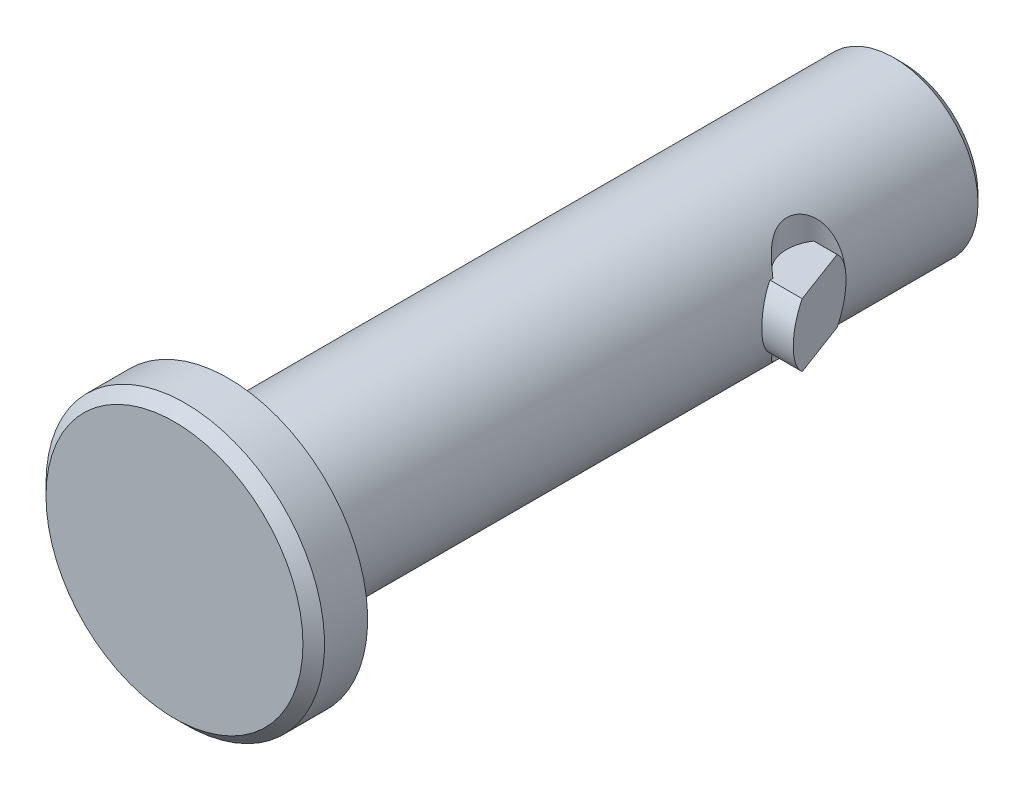
ISO-10303-21;
HEADER;
FILE_DESCRIPTION(('STEP AP214'),'2;1');
FILE_NAME('part.step','',(''),(''),'','','');
FILE_SCHEMA(('AUTOMOTIVE_DESIGN { 1 0 10303 214 1 1 1 1 }'));
ENDSEC;
DATA;
#1=APPLICATION_CONTEXT('core data for automotive mechanical design processes');
#2=APPLICATION_PROTOCOL_DEFINITION('international standard','automotive_design',2000,#1);
#3=PRODUCT_CONTEXT('',#1,'mechanical');
#4=PRODUCT('Part','Part','',(#3));
#5=PRODUCT_RELATED_PRODUCT_CATEGORY('part','',(#4));
#6=PRODUCT_DEFINITION_FORMATION('','',#4);
#7=PRODUCT_DEFINITION_CONTEXT('part definition',#1,'design');
#8=PRODUCT_DEFINITION('design','',#6,#7);
#9=PRODUCT_DEFINITION_SHAPE('','',#8);
#10=(LENGTH_UNIT() NAMED_UNIT(*) SI_UNIT(.MILLI.,.METRE.));
#11=(NAMED_UNIT(*) PLANE_ANGLE_UNIT() SI_UNIT($,.RADIAN.));
#12=(NAMED_UNIT(*) SI_UNIT($,.STERADIAN.) SOLID_ANGLE_UNIT());
#13=UNCERTAINTY_MEASURE_WITH_UNIT(LENGTH_MEASURE(1.E-05),#10,'distance_accuracy_value','');
#14=(GEOMETRIC_REPRESENTATION_CONTEXT(3) GLOBAL_UNCERTAINTY_ASSIGNED_CONTEXT((#13)) GLOBAL_UNIT_ASSIGNED_CONTEXT((#10,
#11,#12)) REPRESENTATION_CONTEXT('',''));
#15=CARTESIAN_POINT('',(0.,0.,0.));
#16=DIRECTION('',(0.,0.,1.));
#17=DIRECTION('',(1.,0.,0.));
#18=AXIS2_PLACEMENT_3D('',#15,#16,#17);
#19=CARTESIAN_POINT('',(7.52684604540094,0.,-4.365625));
#20=DIRECTION('',(-1.,0.,0.));
#21=DIRECTION('',(0.,0.,1.));
#22=AXIS2_PLACEMENT_3D('',#19,#20,#21);
#23=CYLINDRICAL_SURFACE('',#22,1.190625);
#24=CARTESIAN_POINT('',(2.20747783092457,-0.89296875,-3.57810058631593));
#25=CARTESIAN_POINT('',(2.22525680015437,-0.849118208640584,-3.52835882649439));
#26=CARTESIAN_POINT('',(2.24313407200631,-0.801072305564748,-3.48227722960395));
#27=CARTESIAN_POINT('',(2.27746518783692,-0.697456378424291,-3.39836114968579));
#28=CARTESIAN_POINT('',(2.29391270999232,-0.641855473600286,-3.36056227142309));
#29=CARTESIAN_POINT('',(2.3236242177249,-0.524231588072238,-3.29449107584015));
#30=CARTESIAN_POINT('',(2.33687981597009,-0.462192287799817,-3.26624377998065));
#31=CARTESIAN_POINT('',(2.35866945403295,-0.333561056963378,-3.22065147285962));
#32=CARTESIAN_POINT('',(2.36721380741355,-0.266979432409976,-3.2032826357279));
#33=CARTESIAN_POINT('',(2.37818763127264,-0.136251408955325,-3.18110116166184));
#34=CARTESIAN_POINT('',(2.38101464153077,-0.0722771285386694,-3.17547130256736));
#35=CARTESIAN_POINT('',(2.38145677203617,0.0557760872856067,-3.17458587076914));
#36=CARTESIAN_POINT('',(2.3790714874507,0.119855030435997,-3.17933110388651));
#37=CARTESIAN_POINT('',(2.36965152894771,0.242153254781239,-3.19834368794742));
#38=CARTESIAN_POINT('',(2.36291082570402,0.30049094447119,-3.21200950206002));
#39=CARTESIAN_POINT('',(2.34569259379064,0.41397395303492,-3.24770104765574));
#40=CARTESIAN_POINT('',(2.33521352936566,0.469117949070448,-3.26973021512522));
#41=CARTESIAN_POINT('',(2.31085590834111,0.577520424515127,-3.32261641914498));
#42=CARTESIAN_POINT('',(2.29684066119993,0.630568288033956,-3.35383987848441));
#43=CARTESIAN_POINT('',(2.26692822121497,0.730835342606355,-3.42371318473207));
#44=CARTESIAN_POINT('',(2.25103296201118,0.77806042213967,-3.46235542630252));
#45=CARTESIAN_POINT('',(2.22578494955281,0.846720499114228,-3.52787712032862));
#46=CARTESIAN_POINT('',(2.21661225812541,0.870399574400468,-3.55250655751529));
#47=CARTESIAN_POINT('',(2.20747783092457,0.892968750000055,-3.57810058631587));
#48=B_SPLINE_CURVE_WITH_KNOTS('',3,(#24,#25,#26,#27,#28,#29,#30,#31,#32,#33,#34,#35,#36,#37,#38,
#39,#40,#41,#42,#43,#44,#45,#46,#47),.UNSPECIFIED.,.F.,.F.,(4,2,2,2,2,2,2,2,2,2,2,4),(0.,
0.205828446220349,0.412525042908372,0.619758984461825,0.826537442787844,1.01836168407521,
1.210200824653,1.39028022794186,1.57043369495955,1.75905905099473,1.94749206110609,
2.05348674921113),.UNSPECIFIED.);
#49=CARTESIAN_POINT('',(2.20747783092457,-0.892968750000001,-3.57810058631593));
#50=VERTEX_POINT('',#49);
#51=CARTESIAN_POINT('',(2.20747783092457,0.89296875,-3.57810058631593));
#52=VERTEX_POINT('',#51);
#53=EDGE_CURVE('E105',#50,#52,#48,.T.);
#54=ORIENTED_EDGE('',*,*,#53,.F.);
#55=DIRECTION('',(-1.,0.,0.));
#56=VECTOR('',#55,1.);
#57=CARTESIAN_POINT('',(7.52684604540094,-0.89296875,-3.57810058631593));
#58=LINE('',#57,#56);
#59=CARTESIAN_POINT('',(3.11975911444206,-0.892968750000001,-3.57810058631593));
#60=VERTEX_POINT('',#59);
#61=EDGE_CURVE('E181',#60,#50,#58,.T.);
#62=ORIENTED_EDGE('',*,*,#61,.F.);
#63=CARTESIAN_POINT('',(2.82575,0.,-4.365625));
#64=DIRECTION('',(0.936841514727357,0.,-0.349754165498214));
#65=DIRECTION('',(-0.349754165498214,0.,-0.936841514727357));
#66=AXIS2_PLACEMENT_3D('',#63,#64,#65);
#67=ELLIPSE('',#66,1.27089265503622,1.190625);
#68=CARTESIAN_POINT('',(3.11975911444206,0.892968750000001,-3.57810058631593));
#69=VERTEX_POINT('',#68);
#70=EDGE_CURVE('E172',#69,#60,#67,.T.);
#71=ORIENTED_EDGE('',*,*,#70,.F.);
#72=DIRECTION('',(-1.,0.,0.));
#73=VECTOR('',#72,1.);
#74=CARTESIAN_POINT('',(7.52684604540094,0.89296875,-3.57810058631593));
#75=LINE('',#74,#73);
#76=EDGE_CURVE('E183',#52,#69,#75,.F.);
#77=ORIENTED_EDGE('',*,*,#76,.F.);
#78=EDGE_LOOP('',(#54,#62,#71,#77));
#79=FACE_BOUND('',#78,.T.);
#80=ADVANCED_FACE('F50',(#79),#23,.T.);
#81=CARTESIAN_POINT('',(1.8722949957741,0.892968750000001,-5.15314941368407));
#82=CARTESIAN_POINT('',(1.8924211808117,0.866354432189095,-5.18330849928666));
#83=CARTESIAN_POINT('',(1.91360734113642,0.838613594980945,-5.21170159746814));
#84=CARTESIAN_POINT('',(1.95752494145351,0.781159331663294,-5.26502461717634));
#85=CARTESIAN_POINT('',(1.98025481773852,0.751447902359859,-5.28995796756797));
#86=CARTESIAN_POINT('',(2.02680712786073,0.690174043152793,-5.33656978009507));
#87=CARTESIAN_POINT('',(2.05063303605374,0.658605623896169,-5.35823680547731));
#88=CARTESIAN_POINT('',(2.0987344869542,0.593794221565538,-5.3983147003694));
#89=CARTESIAN_POINT('',(2.12301001502869,0.560551292928417,-5.41672567564303));
#90=CARTESIAN_POINT('',(2.17652362098646,0.484964368610081,-5.45399100235197));
#91=CARTESIAN_POINT('',(2.20570278645101,0.4422038347717,-5.47208455625324));
#92=CARTESIAN_POINT('',(2.26176158181058,0.353519397713882,-5.50353085010909));
#93=CARTESIAN_POINT('',(2.28864520831244,0.30760125456047,-5.51689196262031));
#94=CARTESIAN_POINT('',(2.32485579210587,0.233511588261585,-5.53342633129468));
#95=CARTESIAN_POINT('',(2.3365555238136,0.206942952962199,-5.5384544513578));
#96=CARTESIAN_POINT('',(2.3566727301414,0.152352249234631,-5.54678334342676));
#97=CARTESIAN_POINT('',(2.36510038011547,0.124334998676903,-5.55008948149732));
#98=CARTESIAN_POINT('',(2.37608201779761,0.0718442318534708,-5.55432064122322));
#99=CARTESIAN_POINT('',(2.37938123177246,0.0475590769546224,-5.55555083870367));
#100=CARTESIAN_POINT('',(2.38191355587191,-0.0012485889881016,-5.55649879661826));
#101=CARTESIAN_POINT('',(2.38114991351363,-0.0257708948259117,-5.55621776500416));
#102=CARTESIAN_POINT('',(2.37575315540358,-0.0741787014299199,-5.5541836872776));
#103=CARTESIAN_POINT('',(2.37113796577999,-0.0980666242973308,-5.55243746037094));
#104=CARTESIAN_POINT('',(2.35888463259724,-0.144927268018518,-5.54763197887769));
#105=CARTESIAN_POINT('',(2.35124017024138,-0.167897964663183,-5.54456997856954));
#106=CARTESIAN_POINT('',(2.32415982069894,-0.238042645285355,-5.53321512710077));
#107=CARTESIAN_POINT('',(2.30111815363442,-0.283451668473664,-5.52290818087146));
#108=CARTESIAN_POINT('',(2.2513295156893,-0.370994118040339,-5.49789468669189));
#109=CARTESIAN_POINT('',(2.22456188259566,-0.413107077469556,-5.48316303428541));
#110=CARTESIAN_POINT('',(2.1728098141557,-0.490304747577499,-5.45131735323584));
#111=CARTESIAN_POINT('',(2.14795188475826,-0.525653666737742,-5.43464195142426));
#112=CARTESIAN_POINT('',(2.09823754334489,-0.594555547133528,-5.39791309147944));
#113=CARTESIAN_POINT('',(2.07338114693853,-0.628107118399022,-5.37785706727335));
#114=CARTESIAN_POINT('',(2.00010158812864,-0.725814018675784,-5.31266809268998));
#115=CARTESIAN_POINT('',(1.95264852820662,-0.787467764910293,-5.26233137888087));
#116=CARTESIAN_POINT('',(1.89645617766145,-0.861114810972034,-5.1881882861226));
#117=CARTESIAN_POINT('',(1.88418397853995,-0.87724405544158,-5.17097146789805));
#118=CARTESIAN_POINT('',(1.87229499577411,-0.892968750000017,-5.15314941368408));
#119=B_SPLINE_CURVE_WITH_KNOTS('',3,(#81,#82,#83,#84,#85,#86,#87,#88,#89,#90,#91,#92,#93,#94,
#95,#96,#97,#98,#99,#100,#101,#102,#103,#104,#105,#106,#107,#108,#109,#110,#111,#112,#113,#114,
#115,#116,#117,#118),.UNSPECIFIED.,.F.,.F.,(4,2,2,2,2,2,2,2,2,2,2,2,2,2,2,2,2,2,4),(0.,
0.134808452288964,0.269482330354154,0.404617320095088,0.539747919543212,0.704023228797554,
0.868006435886558,0.956223593961701,1.04416417844573,1.11743697698706,1.19065121601267,
1.26352658461282,1.33655477182179,1.4915302168731,1.6474021114129,1.78617491110842,
1.92505352506754,2.20109334115597,2.28082986468615),.UNSPECIFIED.);
#120=CARTESIAN_POINT('',(1.8722949957741,0.892968750000001,-5.15314941368407));
#121=VERTEX_POINT('',#120);
#122=CARTESIAN_POINT('',(2.38125,0.,-5.55625));
#123=VERTEX_POINT('',#122);
#124=EDGE_CURVE('E119',#121,#123,#119,.T.);
#125=ORIENTED_EDGE('',*,*,#124,.F.);
#126=DIRECTION('',(-1.,0.,0.));
#127=VECTOR('',#126,1.);
#128=CARTESIAN_POINT('',(7.52684604540094,0.89296875,-5.15314941368407));
#129=LINE('',#128,#127);
#130=CARTESIAN_POINT('',(2.53174088555795,0.892968750000001,-5.15314941368407));
#131=VERTEX_POINT('',#130);
#132=EDGE_CURVE('E118',#131,#121,#129,.T.);
#133=ORIENTED_EDGE('',*,*,#132,.F.);
#134=EDGE_CURVE('E169',#123,#131,#67,.T.);
#135=ORIENTED_EDGE('',*,*,#134,.F.);
#136=EDGE_LOOP('',(#125,#133,#135));
#137=FACE_BOUND('',#136,.T.);
#138=ADVANCED_FACE('F155',(#137),#23,.T.);
#139=CARTESIAN_POINT('',(1.8722949957741,-0.89296875,-5.15314941368407));
#140=VERTEX_POINT('',#139);
#141=EDGE_CURVE('E65',#123,#140,#119,.T.);
#142=ORIENTED_EDGE('',*,*,#141,.F.);
#143=CARTESIAN_POINT('',(2.53174088555795,-0.892968750000001,-5.15314941368407));
#144=VERTEX_POINT('',#143);
#145=EDGE_CURVE('E168',#144,#123,#67,.T.);
#146=ORIENTED_EDGE('',*,*,#145,.F.);
#147=DIRECTION('',(-1.,0.,0.));
#148=VECTOR('',#147,1.);
#149=CARTESIAN_POINT('',(7.52684604540094,-0.89296875,-5.15314941368407));
#150=LINE('',#149,#148);
#151=EDGE_CURVE('E72',#140,#144,#150,.F.);
#152=ORIENTED_EDGE('',*,*,#151,.F.);
#153=EDGE_LOOP('',(#142,#146,#152));
#154=FACE_BOUND('',#153,.T.);
#155=ADVANCED_FACE('F147',(#154),#23,.T.);
#156=CARTESIAN_POINT('',(3.937,0.89296875,-3.175));
#157=DIRECTION('',(0.,1.,0.));
#158=DIRECTION('',(0.,0.,1.));
#159=AXIS2_PLACEMENT_3D('',#156,#157,#158);
#160=PLANE('',#159);
#161=CARTESIAN_POINT('',(2.75050455722103,0.89296875,-4.56717529315796));
#162=DIRECTION('',(0.,1.,0.));
#163=DIRECTION('',(0.,0.,1.));
#164=AXIS2_PLACEMENT_3D('',#161,#162,#163);
#165=CIRCLE('',#164,1.05575456605366);
#166=CARTESIAN_POINT('',(2.20747783092457,0.89296875,-3.66178052938312));
#167=VERTEX_POINT('',#166);
#168=EDGE_CURVE('E111',#121,#167,#165,.T.);
#169=ORIENTED_EDGE('',*,*,#168,.T.);
#170=DIRECTION('',(0.,0.,-1.));
#171=VECTOR('',#170,1.);
#172=CARTESIAN_POINT('',(2.20747783092457,0.89296875,9.525));
#173=LINE('',#172,#171);
#174=EDGE_CURVE('E100',#167,#52,#173,.F.);
#175=ORIENTED_EDGE('',*,*,#174,.T.);
#176=ORIENTED_EDGE('',*,*,#76,.T.);
#177=DIRECTION('',(0.349754165498214,0.,0.936841514727357));
#178=VECTOR('',#177,1.);
#179=CARTESIAN_POINT('',(2.38125,0.892968750000001,-5.55625));
#180=LINE('',#179,#178);
#181=EDGE_CURVE('E174',#131,#69,#180,.T.);
#182=ORIENTED_EDGE('',*,*,#181,.F.);
#183=ORIENTED_EDGE('',*,*,#132,.T.);
#184=EDGE_LOOP('',(#169,#175,#176,#182,#183));
#185=FACE_BOUND('',#184,.T.);
#186=ADVANCED_FACE('F115',(#185),#160,.T.);
#187=CARTESIAN_POINT('',(3.937,-0.89296875,-5.55625));
#188=DIRECTION('',(0.,-1.,0.));
#189=DIRECTION('',(0.,0.,-1.));
#190=AXIS2_PLACEMENT_3D('',#187,#188,#189);
#191=PLANE('',#190);
#192=ORIENTED_EDGE('',*,*,#61,.T.);
#193=DIRECTION('',(0.,0.,-1.));
#194=VECTOR('',#193,1.);
#195=CARTESIAN_POINT('',(2.20747783092457,-0.892968750000001,9.525));
#196=LINE('',#195,#194);
#197=CARTESIAN_POINT('',(2.20747783092457,-0.89296875,-3.66178052938312));
#198=VERTEX_POINT('',#197);
#199=EDGE_CURVE('E14',#50,#198,#196,.T.);
#200=ORIENTED_EDGE('',*,*,#199,.T.);
#201=CARTESIAN_POINT('',(2.75050455722103,-0.89296875,-4.56717529315796));
#202=DIRECTION('',(0.,-1.,0.));
#203=DIRECTION('',(0.,0.,-1.));
#204=AXIS2_PLACEMENT_3D('',#201,#202,#203);
#205=CIRCLE('',#204,1.05575456605366);
#206=EDGE_CURVE('E58',#198,#140,#205,.T.);
#207=ORIENTED_EDGE('',*,*,#206,.T.);
#208=ORIENTED_EDGE('',*,*,#151,.T.);
#209=DIRECTION('',(-0.349754165498214,0.,-0.936841514727357));
#210=VECTOR('',#209,1.);
#211=CARTESIAN_POINT('',(2.38125,-0.892968750000001,-5.55625));
#212=LINE('',#211,#210);
#213=EDGE_CURVE('E173',#60,#144,#212,.T.);
#214=ORIENTED_EDGE('',*,*,#213,.F.);
#215=EDGE_LOOP('',(#192,#200,#207,#208,#214));
#216=FACE_BOUND('',#215,.T.);
#217=ADVANCED_FACE('F138',(#216),#191,.T.);
#218=CARTESIAN_POINT('',(2.38125,29.2427669475718,-5.55625));
#219=DIRECTION('',(0.936841514727357,0.,-0.349754165498214));
#220=DIRECTION('',(-0.349754165498214,0.,-0.936841514727357));
#221=AXIS2_PLACEMENT_3D('',#218,#219,#220);
#222=PLANE('',#221);
#223=ORIENTED_EDGE('',*,*,#70,.T.);
#224=ORIENTED_EDGE('',*,*,#213,.T.);
#225=ORIENTED_EDGE('',*,*,#145,.T.);
#226=ORIENTED_EDGE('',*,*,#134,.T.);
#227=ORIENTED_EDGE('',*,*,#181,.T.);
#228=EDGE_LOOP('',(#223,#224,#225,#226,#227));
#229=FACE_BOUND('',#228,.T.);
#230=ADVANCED_FACE('F145',(#229),#222,.T.);
#231=CARTESIAN_POINT('',(2.75050455722103,-3.937,-4.56717529315796));
#232=DIRECTION('',(0.,1.,0.));
#233=DIRECTION('',(0.,0.,1.));
#234=AXIS2_PLACEMENT_3D('',#231,#232,#233);
#235=CYLINDRICAL_SURFACE('',#234,1.05575456605366);
#236=ORIENTED_EDGE('',*,*,#124,.T.);
#237=ORIENTED_EDGE('',*,*,#141,.T.);
#238=ORIENTED_EDGE('',*,*,#206,.F.);
#239=CARTESIAN_POINT('',(2.38125,0.,-3.57810058631593));
#240=CARTESIAN_POINT('',(2.38125011808955,0.0614245979316725,-3.57810124807702));
#241=CARTESIAN_POINT('',(2.37887160043626,0.122845989473103,-3.57897889630684));
#242=CARTESIAN_POINT('',(2.36937841398489,0.245295357026814,-3.58260090940448));
#243=CARTESIAN_POINT('',(2.36226176028185,0.306323157332539,-3.58534605661746));
#244=CARTESIAN_POINT('',(2.34335299192169,0.427567885090265,-3.59303453174816));
#245=CARTESIAN_POINT('',(2.33155706764297,0.48778411039356,-3.59797965116971));
#246=CARTESIAN_POINT('',(2.30344393778648,0.606826290012578,-3.6106241262697));
#247=CARTESIAN_POINT('',(2.28712888196554,0.665652890969779,-3.61832217288258));
#248=CARTESIAN_POINT('',(2.24325251315972,0.803212952659003,-3.64081632678406));
#249=CARTESIAN_POINT('',(2.21376984736517,0.881098627838891,-3.65719384712639));
#250=CARTESIAN_POINT('',(2.14795803225805,1.03116085885596,-3.6993746651871));
#251=CARTESIAN_POINT('',(2.11164525319867,1.10335049138478,-3.72515556108794));
#252=CARTESIAN_POINT('',(2.04540380319801,1.22061159850306,-3.78056380489903));
#253=CARTESIAN_POINT('',(2.01647987322437,1.2676680149551,-3.80716486242624));
#254=CARTESIAN_POINT('',(1.9581247598803,1.35605535114776,-3.86822712624743));
#255=CARTESIAN_POINT('',(1.92869430814582,1.39739385837372,-3.90267775244031));
#256=CARTESIAN_POINT('',(1.87724372149388,1.46552776550049,-3.97258893664091));
#257=CARTESIAN_POINT('',(1.85489161283545,1.49358945717345,-4.00656423513585));
#258=CARTESIAN_POINT('',(1.81295696063595,1.5442211188159,-4.07993462013586));
#259=CARTESIAN_POINT('',(1.79337352399616,1.56679286139471,-4.11932795080389));
#260=CARTESIAN_POINT('',(1.75845384135686,1.60589191987398,-4.20313509111992));
#261=CARTESIAN_POINT('',(1.74314677637908,1.62237794197817,-4.247580615867));
#262=CARTESIAN_POINT('',(1.71838120409873,1.64858984829185,-4.33997245435011));
#263=CARTESIAN_POINT('',(1.70892001536018,1.65831883213125,-4.38791715175521));
#264=CARTESIAN_POINT('',(1.6974703057984,1.67003101008412,-4.47983500705963));
#265=CARTESIAN_POINT('',(1.69473941384196,1.67278476803736,-4.52361983805222));
#266=CARTESIAN_POINT('',(1.69476061552473,1.672763887316,-4.61117844737803));
#267=CARTESIAN_POINT('',(1.69751065470446,1.66999132011624,-4.65495222370384));
#268=CARTESIAN_POINT('',(1.70802968078912,1.65922805223782,-4.73917724926833));
#269=CARTESIAN_POINT('',(1.71556605904359,1.65147901454145,-4.77968922901066));
#270=CARTESIAN_POINT('',(1.73490328049398,1.63115218535525,-4.85840479060435));
#271=CARTESIAN_POINT('',(1.74670400938582,1.61857452329404,-4.89660843429763));
#272=CARTESIAN_POINT('',(1.77423142261902,1.58835862263036,-4.97107751823983));
#273=CARTESIAN_POINT('',(1.7900754478989,1.57056622781188,-5.00723649136052));
#274=CARTESIAN_POINT('',(1.82443284170625,1.53052004608163,-5.07557888368875));
#275=CARTESIAN_POINT('',(1.84294708045437,1.50826480380438,-5.10776100046818));
#276=CARTESIAN_POINT('',(1.88374726802203,1.45706259814191,-5.17127046985959));
#277=CARTESIAN_POINT('',(1.90622316905386,1.42764429577744,-5.20209344992772));
#278=CARTESIAN_POINT('',(1.95180923367822,1.36466518539127,-5.25856718434283));
#279=CARTESIAN_POINT('',(1.97491974628277,1.33110206089853,-5.28421502511028));
#280=CARTESIAN_POINT('',(2.03435475708593,1.2394486752472,-5.34465378470708));
#281=CARTESIAN_POINT('',(2.07032315065422,1.17868662937114,-5.37574996379126));
#282=CARTESIAN_POINT('',(2.13805850577893,1.05087168775583,-5.428206902432));
#283=CARTESIAN_POINT('',(2.16981279069865,0.983800803929334,-5.44953874066298));
#284=CARTESIAN_POINT('',(2.21900588428231,0.86556220083724,-5.47969510445771));
#285=CARTESIAN_POINT('',(2.23792121765501,0.815447923860461,-5.49035286301695));
#286=CARTESIAN_POINT('',(2.27246375390512,0.713549674914787,-5.50870537440056));
#287=CARTESIAN_POINT('',(2.2880896039597,0.661765026050951,-5.51639890924302));
#288=CARTESIAN_POINT('',(2.31583089783176,0.556972958964236,-5.52941782573283));
#289=CARTESIAN_POINT('',(2.32794578690464,0.503965348935955,-5.53474283321524));
#290=CARTESIAN_POINT('',(2.34853844324439,0.397090418071016,-5.54347748385738));
#291=CARTESIAN_POINT('',(2.35701580671833,0.343223002477471,-5.54688691438653));
#292=CARTESIAN_POINT('',(2.37042841697871,0.233560625206126,-5.55216930196915));
#293=CARTESIAN_POINT('',(2.37526658028239,0.177751800716734,-5.55400032531744));
#294=CARTESIAN_POINT('',(2.38099654422716,0.0659023403303925,-5.55616002549344));
#295=CARTESIAN_POINT('',(2.38188820790862,0.00986169645591822,-5.55648865018181));
#296=CARTESIAN_POINT('',(2.37971632871633,-0.102211532826054,-5.55567681260729));
#297=CARTESIAN_POINT('',(2.37664725473449,-0.158243997442312,-5.55453429592355));
#298=CARTESIAN_POINT('',(2.36656911562242,-0.269897000329786,-5.55065899644305));
#299=CARTESIAN_POINT('',(2.35956012301651,-0.325517546164331,-5.54792624291866));
#300=CARTESIAN_POINT('',(2.34061673381393,-0.44245771250973,-5.54017460146637));
#301=CARTESIAN_POINT('',(2.32820337582695,-0.503685762098012,-5.53492632840034));
#302=CARTESIAN_POINT('',(2.29868875113045,-0.624709335163551,-5.52150394117833));
#303=CARTESIAN_POINT('',(2.28158559214649,-0.684504269784776,-5.51332864559847));
#304=CARTESIAN_POINT('',(2.24303844362841,-0.801828007946171,-5.49322465257316));
#305=CARTESIAN_POINT('',(2.22160871624754,-0.859363533777951,-5.48130821763521));
#306=CARTESIAN_POINT('',(2.1748885308043,-0.971542859155413,-5.45263242040103));
#307=CARTESIAN_POINT('',(2.14960255400176,-1.02618991732476,-5.4358786595215));
#308=CARTESIAN_POINT('',(2.09548310599215,-1.13266511289161,-5.3958603633889));
#309=CARTESIAN_POINT('',(2.06659240471624,-1.18442192269879,-5.37248053603787));
#310=CARTESIAN_POINT('',(2.00713903111587,-1.28258405244157,-5.31793857810372));
#311=CARTESIAN_POINT('',(1.97657930985742,-1.32899839404388,-5.2867898569943));
#312=CARTESIAN_POINT('',(1.92139212078321,-1.40729615587079,-5.22190090722758));
#313=CARTESIAN_POINT('',(1.89667321175013,-1.44029698045624,-5.18959846979371));
#314=CARTESIAN_POINT('',(1.84928132066635,-1.50066049824571,-5.11874284622722));
#315=CARTESIAN_POINT('',(1.82660802599302,-1.52802405379299,-5.08019061775113));
#316=CARTESIAN_POINT('',(1.78503068250027,-1.57640379397898,-4.99689555249062));
#317=CARTESIAN_POINT('',(1.76616014976908,-1.59736431237975,-4.95210309506408));
#318=CARTESIAN_POINT('',(1.73432360914759,-1.63188013327777,-4.8577984734265));
#319=CARTESIAN_POINT('',(1.72135288684166,-1.64544135013822,-4.80829011599133));
#320=CARTESIAN_POINT('',(1.70405958912994,-1.66332879166198,-4.71390646585536));
#321=CARTESIAN_POINT('',(1.69875158942032,-1.66871347158039,-4.66940860993013));
#322=CARTESIAN_POINT('',(1.69387377236673,-1.67366583192456,-4.57978434621552));
#323=CARTESIAN_POINT('',(1.69430133563599,-1.67323616771504,-4.53465823475127));
#324=CARTESIAN_POINT('',(1.70063112723806,-1.66679980731557,-4.44829650322316));
#325=CARTESIAN_POINT('',(1.70616151622552,-1.66117187632969,-4.40700402083849));
#326=CARTESIAN_POINT('',(1.72177388210333,-1.64498377074146,-4.32630269922399));
#327=CARTESIAN_POINT('',(1.73185526574499,-1.63442423899583,-4.28689361522242));
#328=CARTESIAN_POINT('',(1.75608636073139,-1.60836305985018,-4.21025165013785));
#329=CARTESIAN_POINT('',(1.77030403595,-1.59277833703464,-4.17306878349313));
#330=CARTESIAN_POINT('',(1.80178521582647,-1.55707636310722,-4.10236447250081));
#331=CARTESIAN_POINT('',(1.81904958157822,-1.53695783014657,-4.0688440676323));
#332=CARTESIAN_POINT('',(1.85731074821927,-1.49054732955374,-4.00289674386271));
#333=CARTESIAN_POINT('',(1.87850595449994,-1.46385231039717,-3.97087039936349));
#334=CARTESIAN_POINT('',(1.92200451163107,-1.40625682570598,-3.91177128890602));
#335=CARTESIAN_POINT('',(1.94430838318206,-1.37535437201123,-3.88470087906507));
#336=CARTESIAN_POINT('',(2.00109731536202,-1.29215893604836,-3.82174820781908));
#337=CARTESIAN_POINT('',(2.03558477248798,-1.23739862384558,-3.78912376113361));
#338=CARTESIAN_POINT('',(2.10162275878156,-1.12160969509422,-3.7332354712221));
#339=CARTESIAN_POINT('',(2.13316429877989,-1.06056301608039,-3.70999960205432));
#340=CARTESIAN_POINT('',(2.18320147528221,-0.95209090085049,-3.67643927262621));
#341=CARTESIAN_POINT('',(2.20285668097893,-0.905727087520319,-3.66432217189686));
#342=CARTESIAN_POINT('',(2.23938539925806,-0.811215412747664,-3.6431504262146));
#343=CARTESIAN_POINT('',(2.25625758004023,-0.763066710577252,-3.63409724531555));
#344=CARTESIAN_POINT('',(2.28695132878091,-0.665449673607559,-3.61847503804297));
#345=CARTESIAN_POINT('',(2.30077439961734,-0.615982002453471,-3.61190478671244));
#346=CARTESIAN_POINT('',(2.32523180968785,-0.516039553007757,-3.60076925795906));
#347=CARTESIAN_POINT('',(2.33586548542639,-0.46556456748878,-3.59620439762962));
#348=CARTESIAN_POINT('',(2.35693265721885,-0.346448251304045,-3.5874338229897));
#349=CARTESIAN_POINT('',(2.36604352323356,-0.277520628134438,-3.58388971021059));
#350=CARTESIAN_POINT('',(2.37820207620479,-0.139060627027108,-3.57922273794032));
#351=CARTESIAN_POINT('',(2.38124986633106,-0.0695282593999818,-3.57809983724963));
#352=CARTESIAN_POINT('',(2.38125,0.,-3.57810058631593));
#353=B_SPLINE_CURVE_WITH_KNOTS('',3,(#239,#240,#241,#242,#243,#244,#245,#246,#247,#248,#249,
#250,#251,#252,#253,#254,#255,#256,#257,#258,#259,#260,#261,#262,#263,#264,#265,#266,#267,#268,
#269,#270,#271,#272,#273,#274,#275,#276,#277,#278,#279,#280,#281,#282,#283,#284,#285,#286,#287,
#288,#289,#290,#291,#292,#293,#294,#295,#296,#297,#298,#299,#300,#301,#302,#303,#304,#305,#306,
#307,#308,#309,#310,#311,#312,#313,#314,#315,#316,#317,#318,#319,#320,#321,#322,#323,#324,#325,
#326,#327,#328,#329,#330,#331,#332,#333,#334,#335,#336,#337,#338,#339,#340,#341,#342,#343,#344,
#345,#346,#347,#348,#349,#350,#351,#352),.UNSPECIFIED.,.T.,.F.,(4,2,2,2,2,2,2,2,2,2,2,2,2,2,2,2,
2,2,2,2,2,2,2,2,2,2,2,2,2,2,2,2,2,2,2,2,2,2,2,2,2,2,2,2,2,2,2,2,2,2,2,2,2,2,2,2,4),(0.,
0.184215285909158,0.368507792079525,0.552950648696318,0.737305915842345,0.991100523822772,
1.24429442014654,1.42759581961282,1.61065160128464,1.75828699862605,1.90587466358853,
2.05444611676046,2.20294937123191,2.33414593726715,2.46529333513548,2.59050954008224,
2.71572238891176,2.84509256145368,2.97450499131508,3.11849080626794,3.26255745976691,
3.49271257587425,3.72354505366789,3.88718898162696,4.05090007837605,4.21463702798898,
4.3783921489457,4.54637437401409,4.71436242870545,4.88258533013085,5.05080513508277,
5.23863683728863,5.42654443897559,5.61384244673929,5.80092443530694,5.99148576201482,
6.18172042005464,6.33823836240078,6.49473234410602,6.65255047231603,6.81024226884088,
6.9449344520223,7.07956512443156,7.20509967594146,7.33061786801368,7.45832774951194,
7.58607378395701,7.72585556412652,7.86570362681784,8.08190174444211,8.29873937467305,
8.45393054552346,8.60919576808168,8.76438428999942,8.91960507370594,9.1281271734138,
9.33664572486418),.UNSPECIFIED.);
#354=EDGE_CURVE('E103',#198,#167,#353,.T.);
#355=ORIENTED_EDGE('',*,*,#354,.T.);
#356=ORIENTED_EDGE('',*,*,#168,.F.);
#357=EDGE_LOOP('',(#236,#237,#238,#355,#356));
#358=FACE_BOUND('',#357,.T.);
#359=ADVANCED_FACE('F110',(#358),#235,.T.);
#360=CARTESIAN_POINT('',(0.,0.,9.525));
#361=DIRECTION('',(0.,0.,-1.));
#362=DIRECTION('',(-1.,0.,0.));
#363=AXIS2_PLACEMENT_3D('',#360,#361,#362);
#364=CYLINDRICAL_SURFACE('',#363,2.38125);
#365=ORIENTED_EDGE('',*,*,#354,.F.);
#366=ORIENTED_EDGE('',*,*,#199,.F.);
#367=ORIENTED_EDGE('',*,*,#53,.T.);
#368=ORIENTED_EDGE('',*,*,#174,.F.);
#369=EDGE_LOOP('',(#365,#366,#367,#368));
#370=FACE_BOUND('',#369,.T.);
#371=ADVANCED_FACE('F102',(#370),#364,.F.);
#372=CLOSED_SHELL('',(#80,#138,#155,#186,#217,#230,#359,#371));
#373=MANIFOLD_SOLID_BREP('B2',#372);
#374=CARTESIAN_POINT('',(0.,0.,9.525));
#375=DIRECTION('',(0.,0.,-1.));
#376=DIRECTION('',(-1.,0.,0.));
#377=AXIS2_PLACEMENT_3D('',#374,#375,#376);
#378=CYLINDRICAL_SURFACE('',#377,2.38125);
#379=CARTESIAN_POINT('',(2.38125,0.,-3.57810058631593));
#380=CARTESIAN_POINT('',(2.38125011808955,0.0614245979316725,-3.57810124807702));
#381=CARTESIAN_POINT('',(2.37887160043626,0.122845989473103,-3.57897889630684));
#382=CARTESIAN_POINT('',(2.36937841398489,0.245295357026814,-3.58260090940448));
#383=CARTESIAN_POINT('',(2.36226176028185,0.306323157332539,-3.58534605661746));
#384=CARTESIAN_POINT('',(2.34335299192169,0.427567885090265,-3.59303453174816));
#385=CARTESIAN_POINT('',(2.33155706764297,0.48778411039356,-3.59797965116971));
#386=CARTESIAN_POINT('',(2.30344393778648,0.606826290012578,-3.6106241262697));
#387=CARTESIAN_POINT('',(2.28712888196554,0.665652890969779,-3.61832217288258));
#388=CARTESIAN_POINT('',(2.24325251315972,0.803212952659003,-3.64081632678406));
#389=CARTESIAN_POINT('',(2.21376984736517,0.881098627838891,-3.65719384712639));
#390=CARTESIAN_POINT('',(2.14795803225805,1.03116085885596,-3.6993746651871));
#391=CARTESIAN_POINT('',(2.11164525319867,1.10335049138478,-3.72515556108794));
#392=CARTESIAN_POINT('',(2.04540380319801,1.22061159850306,-3.78056380489903));
#393=CARTESIAN_POINT('',(2.01647987322437,1.2676680149551,-3.80716486242624));
#394=CARTESIAN_POINT('',(1.9581247598803,1.35605535114776,-3.86822712624743));
#395=CARTESIAN_POINT('',(1.92869430814582,1.39739385837372,-3.90267775244031));
#396=CARTESIAN_POINT('',(1.87724372149388,1.46552776550049,-3.97258893664091));
#397=CARTESIAN_POINT('',(1.85489161283545,1.49358945717345,-4.00656423513585));
#398=CARTESIAN_POINT('',(1.81295696063595,1.5442211188159,-4.07993462013586));
#399=CARTESIAN_POINT('',(1.79337352399616,1.56679286139471,-4.11932795080389));
#400=CARTESIAN_POINT('',(1.75845384135686,1.60589191987398,-4.20313509111992));
#401=CARTESIAN_POINT('',(1.74314677637908,1.62237794197817,-4.247580615867));
#402=CARTESIAN_POINT('',(1.71838120409873,1.64858984829185,-4.33997245435011));
#403=CARTESIAN_POINT('',(1.70892001536018,1.65831883213125,-4.38791715175521));
#404=CARTESIAN_POINT('',(1.6974703057984,1.67003101008412,-4.47983500705963));
#405=CARTESIAN_POINT('',(1.69473941384196,1.67278476803736,-4.52361983805222));
#406=CARTESIAN_POINT('',(1.69476061552473,1.672763887316,-4.61117844737803));
#407=CARTESIAN_POINT('',(1.69751065470446,1.66999132011624,-4.65495222370384));
#408=CARTESIAN_POINT('',(1.70802968078912,1.65922805223782,-4.73917724926833));
#409=CARTESIAN_POINT('',(1.71556605904359,1.65147901454145,-4.77968922901066));
#410=CARTESIAN_POINT('',(1.73490328049398,1.63115218535525,-4.85840479060435));
#411=CARTESIAN_POINT('',(1.74670400938582,1.61857452329404,-4.89660843429763));
#412=CARTESIAN_POINT('',(1.77423142261902,1.58835862263036,-4.97107751823983));
#413=CARTESIAN_POINT('',(1.7900754478989,1.57056622781188,-5.00723649136052));
#414=CARTESIAN_POINT('',(1.82443284170625,1.53052004608163,-5.07557888368875));
#415=CARTESIAN_POINT('',(1.84294708045437,1.50826480380438,-5.10776100046818));
#416=CARTESIAN_POINT('',(1.88374726802203,1.45706259814191,-5.17127046985959));
#417=CARTESIAN_POINT('',(1.90622316905386,1.42764429577744,-5.20209344992772));
#418=CARTESIAN_POINT('',(1.95180923367822,1.36466518539127,-5.25856718434283));
#419=CARTESIAN_POINT('',(1.97491974628277,1.33110206089853,-5.28421502511028));
#420=CARTESIAN_POINT('',(2.03435475708593,1.2394486752472,-5.34465378470708));
#421=CARTESIAN_POINT('',(2.07032315065422,1.17868662937114,-5.37574996379126));
#422=CARTESIAN_POINT('',(2.13805850577893,1.05087168775583,-5.428206902432));
#423=CARTESIAN_POINT('',(2.16981279069865,0.983800803929334,-5.44953874066298));
#424=CARTESIAN_POINT('',(2.21900588428231,0.86556220083724,-5.47969510445771));
#425=CARTESIAN_POINT('',(2.23792121765501,0.815447923860461,-5.49035286301695));
#426=CARTESIAN_POINT('',(2.27246375390512,0.713549674914787,-5.50870537440056));
#427=CARTESIAN_POINT('',(2.2880896039597,0.661765026050951,-5.51639890924302));
#428=CARTESIAN_POINT('',(2.31583089783176,0.556972958964236,-5.52941782573283));
#429=CARTESIAN_POINT('',(2.32794578690464,0.503965348935955,-5.53474283321524));
#430=CARTESIAN_POINT('',(2.34853844324439,0.397090418071016,-5.54347748385738));
#431=CARTESIAN_POINT('',(2.35701580671833,0.343223002477471,-5.54688691438653));
#432=CARTESIAN_POINT('',(2.37042841697871,0.233560625206126,-5.55216930196915));
#433=CARTESIAN_POINT('',(2.37526658028239,0.177751800716734,-5.55400032531744));
#434=CARTESIAN_POINT('',(2.38099654422716,0.0659023403303925,-5.55616002549344));
#435=CARTESIAN_POINT('',(2.38188820790862,0.00986169645591822,-5.55648865018181));
#436=CARTESIAN_POINT('',(2.37971632871633,-0.102211532826054,-5.55567681260729));
#437=CARTESIAN_POINT('',(2.37664725473449,-0.158243997442312,-5.55453429592355));
#438=CARTESIAN_POINT('',(2.36656911562242,-0.269897000329786,-5.55065899644305));
#439=CARTESIAN_POINT('',(2.35956012301651,-0.325517546164331,-5.54792624291866));
#440=CARTESIAN_POINT('',(2.34061673381393,-0.44245771250973,-5.54017460146637));
#441=CARTESIAN_POINT('',(2.32820337582695,-0.503685762098012,-5.53492632840034));
#442=CARTESIAN_POINT('',(2.29868875113045,-0.624709335163551,-5.52150394117833));
#443=CARTESIAN_POINT('',(2.28158559214649,-0.684504269784776,-5.51332864559847));
#444=CARTESIAN_POINT('',(2.24303844362841,-0.801828007946171,-5.49322465257316));
#445=CARTESIAN_POINT('',(2.22160871624754,-0.859363533777951,-5.48130821763521));
#446=CARTESIAN_POINT('',(2.1748885308043,-0.971542859155413,-5.45263242040103));
#447=CARTESIAN_POINT('',(2.14960255400176,-1.02618991732476,-5.4358786595215));
#448=CARTESIAN_POINT('',(2.09548310599215,-1.13266511289161,-5.3958603633889));
#449=CARTESIAN_POINT('',(2.06659240471624,-1.18442192269879,-5.37248053603787));
#450=CARTESIAN_POINT('',(2.00713903111587,-1.28258405244157,-5.31793857810372));
#451=CARTESIAN_POINT('',(1.97657930985742,-1.32899839404388,-5.2867898569943));
#452=CARTESIAN_POINT('',(1.92139212078321,-1.40729615587079,-5.22190090722758));
#453=CARTESIAN_POINT('',(1.89667321175013,-1.44029698045624,-5.18959846979371));
#454=CARTESIAN_POINT('',(1.84928132066635,-1.50066049824571,-5.11874284622722));
#455=CARTESIAN_POINT('',(1.82660802599302,-1.52802405379299,-5.08019061775113));
#456=CARTESIAN_POINT('',(1.78503068250027,-1.57640379397898,-4.99689555249062));
#457=CARTESIAN_POINT('',(1.76616014976908,-1.59736431237975,-4.95210309506408));
#458=CARTESIAN_POINT('',(1.73432360914759,-1.63188013327777,-4.8577984734265));
#459=CARTESIAN_POINT('',(1.72135288684166,-1.64544135013822,-4.80829011599133));
#460=CARTESIAN_POINT('',(1.70405958912994,-1.66332879166198,-4.71390646585536));
#461=CARTESIAN_POINT('',(1.69875158942032,-1.66871347158039,-4.66940860993013));
#462=CARTESIAN_POINT('',(1.69387377236673,-1.67366583192456,-4.57978434621552));
#463=CARTESIAN_POINT('',(1.69430133563599,-1.67323616771504,-4.53465823475127));
#464=CARTESIAN_POINT('',(1.70063112723806,-1.66679980731557,-4.44829650322316));
#465=CARTESIAN_POINT('',(1.70616151622552,-1.66117187632969,-4.40700402083849));
#466=CARTESIAN_POINT('',(1.72177388210333,-1.64498377074146,-4.32630269922399));
#467=CARTESIAN_POINT('',(1.73185526574499,-1.63442423899583,-4.28689361522242));
#468=CARTESIAN_POINT('',(1.75608636073139,-1.60836305985018,-4.21025165013785));
#469=CARTESIAN_POINT('',(1.77030403595,-1.59277833703464,-4.17306878349313));
#470=CARTESIAN_POINT('',(1.80178521582647,-1.55707636310722,-4.10236447250081));
#471=CARTESIAN_POINT('',(1.81904958157822,-1.53695783014657,-4.0688440676323));
#472=CARTESIAN_POINT('',(1.85731074821927,-1.49054732955374,-4.00289674386271));
#473=CARTESIAN_POINT('',(1.87850595449994,-1.46385231039717,-3.97087039936349));
#474=CARTESIAN_POINT('',(1.92200451163107,-1.40625682570598,-3.91177128890602));
#475=CARTESIAN_POINT('',(1.94430838318206,-1.37535437201123,-3.88470087906507));
#476=CARTESIAN_POINT('',(2.00109731536202,-1.29215893604836,-3.82174820781908));
#477=CARTESIAN_POINT('',(2.03558477248798,-1.23739862384558,-3.78912376113361));
#478=CARTESIAN_POINT('',(2.10162275878156,-1.12160969509422,-3.7332354712221));
#479=CARTESIAN_POINT('',(2.13316429877989,-1.06056301608039,-3.70999960205432));
#480=CARTESIAN_POINT('',(2.18320147528221,-0.95209090085049,-3.67643927262621));
#481=CARTESIAN_POINT('',(2.20285668097893,-0.905727087520319,-3.66432217189686));
#482=CARTESIAN_POINT('',(2.23938539925806,-0.811215412747664,-3.6431504262146));
#483=CARTESIAN_POINT('',(2.25625758004023,-0.763066710577252,-3.63409724531555));
#484=CARTESIAN_POINT('',(2.28695132878091,-0.665449673607559,-3.61847503804297));
#485=CARTESIAN_POINT('',(2.30077439961734,-0.615982002453471,-3.61190478671244));
#486=CARTESIAN_POINT('',(2.32523180968785,-0.516039553007757,-3.60076925795906));
#487=CARTESIAN_POINT('',(2.33586548542639,-0.46556456748878,-3.59620439762962));
#488=CARTESIAN_POINT('',(2.35693265721885,-0.346448251304045,-3.5874338229897));
#489=CARTESIAN_POINT('',(2.36604352323356,-0.277520628134438,-3.58388971021059));
#490=CARTESIAN_POINT('',(2.37820207620479,-0.139060627027108,-3.57922273794032));
#491=CARTESIAN_POINT('',(2.38124986633106,-0.0695282593999818,-3.57809983724963));
#492=CARTESIAN_POINT('',(2.38125,0.,-3.57810058631593));
#493=B_SPLINE_CURVE_WITH_KNOTS('',3,(#379,#380,#381,#382,#383,#384,#385,#386,#387,#388,#389,
#390,#391,#392,#393,#394,#395,#396,#397,#398,#399,#400,#401,#402,#403,#404,#405,#406,#407,#408,
#409,#410,#411,#412,#413,#414,#415,#416,#417,#418,#419,#420,#421,#422,#423,#424,#425,#426,#427,
#428,#429,#430,#431,#432,#433,#434,#435,#436,#437,#438,#439,#440,#441,#442,#443,#444,#445,#446,
#447,#448,#449,#450,#451,#452,#453,#454,#455,#456,#457,#458,#459,#460,#461,#462,#463,#464,#465,
#466,#467,#468,#469,#470,#471,#472,#473,#474,#475,#476,#477,#478,#479,#480,#481,#482,#483,#484,
#485,#486,#487,#488,#489,#490,#491,#492),.UNSPECIFIED.,.T.,.F.,(4,2,2,2,2,2,2,2,2,2,2,2,2,2,2,2,
2,2,2,2,2,2,2,2,2,2,2,2,2,2,2,2,2,2,2,2,2,2,2,2,2,2,2,2,2,2,2,2,2,2,2,2,2,2,2,2,4),(0.,
0.184215285909158,0.368507792079525,0.552950648696318,0.737305915842345,0.991100523822772,
1.24429442014654,1.42759581961282,1.61065160128464,1.75828699862605,1.90587466358853,
2.05444611676046,2.20294937123191,2.33414593726715,2.46529333513548,2.59050954008224,
2.71572238891176,2.84509256145368,2.97450499131508,3.11849080626794,3.26255745976691,
3.49271257587425,3.72354505366789,3.88718898162696,4.05090007837605,4.21463702798898,
4.3783921489457,4.54637437401409,4.71436242870545,4.88258533013085,5.05080513508277,
5.23863683728863,5.42654443897559,5.61384244673929,5.80092443530694,5.99148576201482,
6.18172042005464,6.33823836240078,6.49473234410602,6.65255047231603,6.81024226884088,
6.9449344520223,7.07956512443156,7.20509967594146,7.33061786801368,7.45832774951194,
7.58607378395701,7.72585556412652,7.86570362681784,8.08190174444211,8.29873937467305,
8.45393054552346,8.60919576808168,8.76438428999942,8.91960507370594,9.1281271734138,
9.33664572486418),.UNSPECIFIED.);
#494=CARTESIAN_POINT('',(2.38125,0.,-3.57810058631593));
#495=VERTEX_POINT('',#494);
#496=EDGE_CURVE('E49',#495,#495,#493,.T.);
#497=ORIENTED_EDGE('',*,*,#496,.T.);
#498=EDGE_LOOP('',(#497));
#499=FACE_BOUND('',#498,.T.);
#500=CARTESIAN_POINT('',(0.,0.,-9.28687499999998));
#501=DIRECTION('',(0.,0.,1.));
#502=DIRECTION('',(1.,0.,0.));
#503=AXIS2_PLACEMENT_3D('',#500,#501,#502);
#504=CIRCLE('',#503,2.38125);
#505=CARTESIAN_POINT('',(2.38125,0.,-9.28687499999998));
#506=VERTEX_POINT('',#505);
#507=EDGE_CURVE('E255',#506,#506,#504,.T.);
#508=ORIENTED_EDGE('',*,*,#507,.T.);
#509=EDGE_LOOP('',(#508));
#510=FACE_BOUND('',#509,.T.);
#511=CARTESIAN_POINT('',(0.,0.,9.525));
#512=DIRECTION('',(0.,0.,1.));
#513=DIRECTION('',(1.,0.,0.));
#514=AXIS2_PLACEMENT_3D('',#511,#512,#513);
#515=CIRCLE('',#514,2.38125);
#516=CARTESIAN_POINT('',(2.38125,0.,9.525));
#517=VERTEX_POINT('',#516);
#518=EDGE_CURVE('E267',#517,#517,#515,.T.);
#519=ORIENTED_EDGE('',*,*,#518,.F.);
#520=EDGE_LOOP('',(#519));
#521=FACE_BOUND('',#520,.T.);
#522=ADVANCED_FACE('F239',(#499,#510,#521),#378,.T.);
#523=CARTESIAN_POINT('',(0.,0.,-9.525));
#524=DIRECTION('',(0.,0.,1.));
#525=DIRECTION('',(1.,0.,0.));
#526=AXIS2_PLACEMENT_3D('',#523,#524,#525);
#527=PLANE('',#526);
#528=CARTESIAN_POINT('',(0.,0.,-9.525));
#529=DIRECTION('',(0.,0.,1.));
#530=DIRECTION('',(1.,0.,0.));
#531=AXIS2_PLACEMENT_3D('',#528,#529,#530);
#532=CIRCLE('',#531,2.14312499999998);
#533=CARTESIAN_POINT('',(2.14312499999998,0.,-9.525));
#534=VERTEX_POINT('',#533);
#535=EDGE_CURVE('E251',#534,#534,#532,.F.);
#536=ORIENTED_EDGE('',*,*,#535,.T.);
#537=EDGE_LOOP('',(#536));
#538=FACE_BOUND('',#537,.T.);
#539=ADVANCED_FACE('F279',(#538),#527,.F.);
#540=CARTESIAN_POINT('',(0.,0.,9.525));
#541=DIRECTION('',(0.,0.,1.));
#542=DIRECTION('',(1.,0.,0.));
#543=AXIS2_PLACEMENT_3D('',#540,#541,#542);
#544=PLANE('',#543);
#545=CARTESIAN_POINT('',(0.,0.,9.525));
#546=DIRECTION('',(0.,0.,1.));
#547=DIRECTION('',(1.,0.,0.));
#548=AXIS2_PLACEMENT_3D('',#545,#546,#547);
#549=CIRCLE('',#548,3.937);
#550=CARTESIAN_POINT('',(-3.937,0.,9.525));
#551=VERTEX_POINT('',#550);
#552=EDGE_CURVE('E270',#551,#551,#549,.T.);
#553=ORIENTED_EDGE('',*,*,#552,.F.);
#554=EDGE_LOOP('',(#553));
#555=FACE_BOUND('',#554,.T.);
#556=ORIENTED_EDGE('',*,*,#518,.T.);
#557=EDGE_LOOP('',(#556));
#558=FACE_BOUND('',#557,.T.);
#559=ADVANCED_FACE('F276',(#555,#558),#544,.F.);
#560=CARTESIAN_POINT('',(0.,0.,11.049));
#561=DIRECTION('',(0.,0.,-1.));
#562=DIRECTION('',(-1.,0.,0.));
#563=AXIS2_PLACEMENT_3D('',#560,#561,#562);
#564=CYLINDRICAL_SURFACE('',#563,3.937);
#565=CARTESIAN_POINT('',(0.,0.,10.7442));
#566=DIRECTION('',(0.,0.,1.));
#567=DIRECTION('',(1.,0.,0.));
#568=AXIS2_PLACEMENT_3D('',#565,#566,#567);
#569=CIRCLE('',#568,3.937);
#570=CARTESIAN_POINT('',(-3.937,0.,10.7442));
#571=VERTEX_POINT('',#570);
#572=EDGE_CURVE('E259',#571,#571,#569,.F.);
#573=CARTESIAN_POINT('',(-3.937,0.,10.7442));
#574=CARTESIAN_POINT('',(-3.937,0.,10.7315));
#575=CARTESIAN_POINT('',(-3.937,0.,10.7188));
#576=CARTESIAN_POINT('',(-3.937,0.,10.6934));
#577=CARTESIAN_POINT('',(-3.937,0.,10.6807));
#578=CARTESIAN_POINT('',(-3.937,0.,10.6553));
#579=CARTESIAN_POINT('',(-3.937,0.,10.6426));
#580=CARTESIAN_POINT('',(-3.937,0.,10.6172));
#581=CARTESIAN_POINT('',(-3.937,0.,10.6045));
#582=CARTESIAN_POINT('',(-3.937,0.,10.5791));
#583=CARTESIAN_POINT('',(-3.937,0.,10.5664));
#584=CARTESIAN_POINT('',(-3.937,0.,10.541));
#585=CARTESIAN_POINT('',(-3.937,0.,10.5283));
#586=CARTESIAN_POINT('',(-3.937,0.,10.5029));
#587=CARTESIAN_POINT('',(-3.937,0.,10.4902));
#588=CARTESIAN_POINT('',(-3.937,0.,10.4648));
#589=CARTESIAN_POINT('',(-3.937,0.,10.4521));
#590=CARTESIAN_POINT('',(-3.937,0.,10.4267));
#591=CARTESIAN_POINT('',(-3.937,0.,10.414));
#592=CARTESIAN_POINT('',(-3.937,0.,10.3886));
#593=CARTESIAN_POINT('',(-3.937,0.,10.3759));
#594=CARTESIAN_POINT('',(-3.937,0.,10.3505));
#595=CARTESIAN_POINT('',(-3.937,0.,10.3378));
#596=CARTESIAN_POINT('',(-3.937,0.,10.3124));
#597=CARTESIAN_POINT('',(-3.937,0.,10.2997));
#598=CARTESIAN_POINT('',(-3.937,0.,10.2743));
#599=CARTESIAN_POINT('',(-3.937,0.,10.2616));
#600=CARTESIAN_POINT('',(-3.937,0.,10.2362));
#601=CARTESIAN_POINT('',(-3.937,0.,10.2235));
#602=CARTESIAN_POINT('',(-3.937,0.,10.1981));
#603=CARTESIAN_POINT('',(-3.937,0.,10.1854));
#604=CARTESIAN_POINT('',(-3.937,0.,10.16));
#605=CARTESIAN_POINT('',(-3.937,0.,10.1473));
#606=CARTESIAN_POINT('',(-3.937,0.,10.1219));
#607=CARTESIAN_POINT('',(-3.937,0.,10.1092));
#608=CARTESIAN_POINT('',(-3.937,0.,10.0838));
#609=CARTESIAN_POINT('',(-3.937,0.,10.0711));
#610=CARTESIAN_POINT('',(-3.937,0.,10.0457));
#611=CARTESIAN_POINT('',(-3.937,0.,10.033));
#612=CARTESIAN_POINT('',(-3.937,0.,10.0076));
#613=CARTESIAN_POINT('',(-3.937,0.,9.99490000000001));
#614=CARTESIAN_POINT('',(-3.937,0.,9.9695));
#615=CARTESIAN_POINT('',(-3.937,0.,9.9568));
#616=CARTESIAN_POINT('',(-3.937,0.,9.93140000000001));
#617=CARTESIAN_POINT('',(-3.937,0.,9.9187));
#618=CARTESIAN_POINT('',(-3.937,0.,9.8933));
#619=CARTESIAN_POINT('',(-3.937,0.,9.8806));
#620=CARTESIAN_POINT('',(-3.937,0.,9.8552));
#621=CARTESIAN_POINT('',(-3.937,0.,9.8425));
#622=CARTESIAN_POINT('',(-3.937,0.,9.8171));
#623=CARTESIAN_POINT('',(-3.937,0.,9.8044));
#624=CARTESIAN_POINT('',(-3.937,0.,9.779));
#625=CARTESIAN_POINT('',(-3.937,0.,9.7663));
#626=CARTESIAN_POINT('',(-3.937,0.,9.7409));
#627=CARTESIAN_POINT('',(-3.937,0.,9.7282));
#628=CARTESIAN_POINT('',(-3.937,0.,9.7028));
#629=CARTESIAN_POINT('',(-3.937,0.,9.6901));
#630=CARTESIAN_POINT('',(-3.937,0.,9.6647));
#631=CARTESIAN_POINT('',(-3.937,0.,9.652));
#632=CARTESIAN_POINT('',(-3.937,0.,9.6266));
#633=CARTESIAN_POINT('',(-3.937,0.,9.6139));
#634=CARTESIAN_POINT('',(-3.937,0.,9.5885));
#635=CARTESIAN_POINT('',(-3.937,0.,9.5758));
#636=CARTESIAN_POINT('',(-3.937,0.,9.5504));
#637=CARTESIAN_POINT('',(-3.937,0.,9.5377));
#638=CARTESIAN_POINT('',(-3.937,0.,9.525));
#639=B_SPLINE_CURVE_WITH_KNOTS('',3,(#573,#574,#575,#576,#577,#578,#579,#580,#581,#582,#583,
#584,#585,#586,#587,#588,#589,#590,#591,#592,#593,#594,#595,#596,#597,#598,#599,#600,#601,#602,
#603,#604,#605,#606,#607,#608,#609,#610,#611,#612,#613,#614,#615,#616,#617,#618,#619,#620,#621,
#622,#623,#624,#625,#626,#627,#628,#629,#630,#631,#632,#633,#634,#635,#636,#637,#638),
.UNSPECIFIED.,.F.,.F.,(4,2,2,2,2,2,2,2,2,2,2,2,2,2,2,2,2,2,2,2,2,2,2,2,2,2,2,2,2,2,2,2,4),(0.,
0.038100000000001,0.076200000000002,0.114300000000003,0.152400000000002,0.190500000000003,
0.228600000000004,0.266700000000003,0.304800000000004,0.342900000000005,0.381000000000005,
0.419100000000006,0.457200000000007,0.495300000000006,0.533400000000007,0.571500000000008,
0.609600000000007,0.647700000000008,0.685800000000009,0.723900000000008,0.762000000000009,
0.80010000000001,0.838200000000009,0.87630000000001,0.914400000000011,0.952500000000012,
0.990600000000012,1.02870000000001,1.06680000000001,1.10490000000001,1.14300000000001,
1.18110000000001,1.21920000000001),.UNSPECIFIED.);
#640=EDGE_CURVE('BSEAM274',#571,#551,#639,.T.);
#641=ORIENTED_EDGE('',*,*,#572,.T.);
#642=ORIENTED_EDGE('',*,*,#552,.T.);
#643=ORIENTED_EDGE('',*,*,#640,.T.);
#644=ORIENTED_EDGE('',*,*,#640,.F.);
#645=EDGE_LOOP('',(#641,#643,#642,#644));
#646=FACE_BOUND('',#645,.T.);
#647=ADVANCED_FACE('F274',(#646),#564,.T.);
#648=CARTESIAN_POINT('',(0.,0.,11.049));
#649=DIRECTION('',(0.,0.,1.));
#650=DIRECTION('',(1.,0.,0.));
#651=AXIS2_PLACEMENT_3D('',#648,#649,#650);
#652=PLANE('',#651);
#653=CARTESIAN_POINT('',(0.,0.,11.049));
#654=DIRECTION('',(0.,0.,1.));
#655=DIRECTION('',(1.,0.,0.));
#656=AXIS2_PLACEMENT_3D('',#653,#654,#655);
#657=CIRCLE('',#656,3.63220000000002);
#658=CARTESIAN_POINT('',(3.63220000000002,0.,11.049));
#659=VERTEX_POINT('',#658);
#660=EDGE_CURVE('E264',#659,#659,#657,.T.);
#661=ORIENTED_EDGE('',*,*,#660,.T.);
#662=EDGE_LOOP('',(#661));
#663=FACE_BOUND('',#662,.T.);
#664=ADVANCED_FACE('F293',(#663),#652,.T.);
#665=CARTESIAN_POINT('',(0.,0.,11.049));
#666=DIRECTION('',(0.,0.,-1.));
#667=DIRECTION('',(-1.,0.,0.));
#668=AXIS2_PLACEMENT_3D('',#665,#666,#667);
#669=CONICAL_SURFACE('',#668,3.63220000000002,0.785398163397447);
#670=ORIENTED_EDGE('',*,*,#572,.F.);
#671=EDGE_LOOP('',(#670));
#672=FACE_BOUND('',#671,.T.);
#673=ORIENTED_EDGE('',*,*,#660,.F.);
#674=EDGE_LOOP('',(#673));
#675=FACE_BOUND('',#674,.T.);
#676=ADVANCED_FACE('F291',(#672,#675),#669,.T.);
#677=CARTESIAN_POINT('',(0.,0.,-9.28687499999998));
#678=DIRECTION('',(0.,0.,1.));
#679=DIRECTION('',(1.,0.,0.));
#680=AXIS2_PLACEMENT_3D('',#677,#678,#679);
#681=CONICAL_SURFACE('',#680,2.38125,0.785398163397447);
#682=ORIENTED_EDGE('',*,*,#535,.F.);
#683=EDGE_LOOP('',(#682));
#684=FACE_BOUND('',#683,.T.);
#685=ORIENTED_EDGE('',*,*,#507,.F.);
#686=EDGE_LOOP('',(#685));
#687=FACE_BOUND('',#686,.T.);
#688=ADVANCED_FACE('F241',(#684,#687),#681,.T.);
#689=CARTESIAN_POINT('',(2.75050455722103,-3.937,-4.56717529315796));
#690=DIRECTION('',(0.,1.,0.));
#691=DIRECTION('',(0.,0.,1.));
#692=AXIS2_PLACEMENT_3D('',#689,#690,#691);
#693=CYLINDRICAL_SURFACE('',#692,1.05575456605366);
#694=ORIENTED_EDGE('',*,*,#496,.F.);
#695=EDGE_LOOP('',(#694));
#696=FACE_BOUND('',#695,.T.);
#697=ADVANCED_FACE('F299',(#696),#693,.F.);
#698=CLOSED_SHELL('',(#522,#539,#559,#647,#664,#676,#688,#697));
#699=MANIFOLD_SOLID_BREP('B8',#698);
#700=ADVANCED_BREP_SHAPE_REPRESENTATION('',(#18,#373,#699),#14);
#701=SHAPE_DEFINITION_REPRESENTATION(#9,#700);
ENDSEC;
END-ISO-10303-21;
